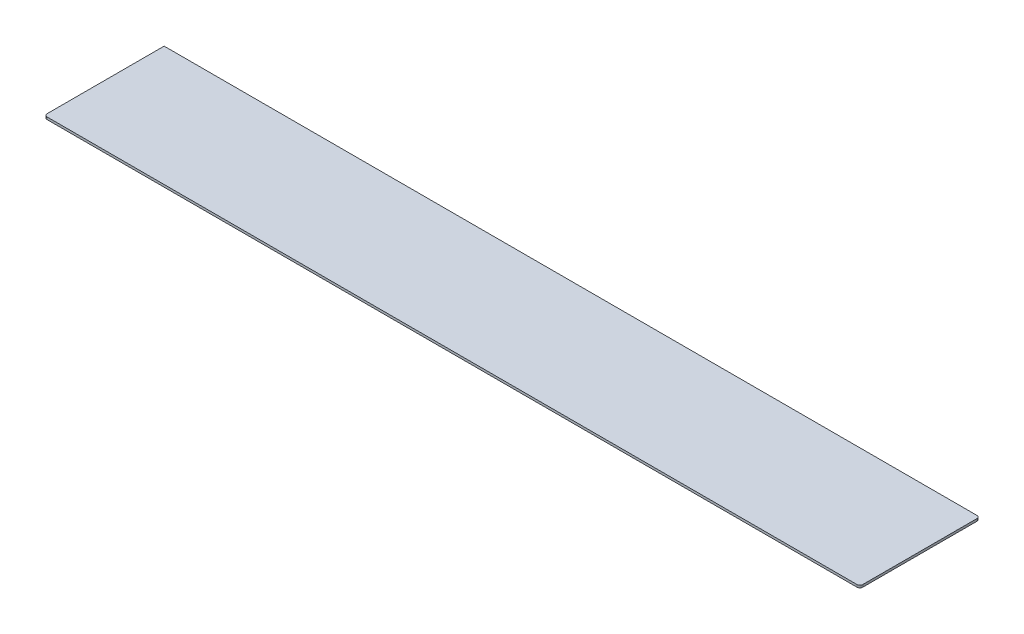
ISO-10303-21;
HEADER;
FILE_DESCRIPTION(('STEP AP214'),'2;1');
FILE_NAME('part.step','',(''),(''),'','','');
FILE_SCHEMA(('AUTOMOTIVE_DESIGN { 1 0 10303 214 1 1 1 1 }'));
ENDSEC;
DATA;
#1=APPLICATION_CONTEXT('core data for automotive mechanical design processes');
#2=APPLICATION_PROTOCOL_DEFINITION('international standard','automotive_design',2000,#1);
#3=PRODUCT_CONTEXT('',#1,'mechanical');
#4=PRODUCT('Part','Part','',(#3));
#5=PRODUCT_RELATED_PRODUCT_CATEGORY('part','',(#4));
#6=PRODUCT_DEFINITION_FORMATION('','',#4);
#7=PRODUCT_DEFINITION_CONTEXT('part definition',#1,'design');
#8=PRODUCT_DEFINITION('design','',#6,#7);
#9=PRODUCT_DEFINITION_SHAPE('','',#8);
#10=(LENGTH_UNIT() NAMED_UNIT(*) SI_UNIT(.MILLI.,.METRE.));
#11=(NAMED_UNIT(*) PLANE_ANGLE_UNIT() SI_UNIT($,.RADIAN.));
#12=(NAMED_UNIT(*) SI_UNIT($,.STERADIAN.) SOLID_ANGLE_UNIT());
#13=UNCERTAINTY_MEASURE_WITH_UNIT(LENGTH_MEASURE(1.E-05),#10,'distance_accuracy_value','');
#14=(GEOMETRIC_REPRESENTATION_CONTEXT(3) GLOBAL_UNCERTAINTY_ASSIGNED_CONTEXT((#13)) GLOBAL_UNIT_ASSIGNED_CONTEXT((#10,
#11,#12)) REPRESENTATION_CONTEXT('',''));
#15=CARTESIAN_POINT('',(0.,0.,0.));
#16=DIRECTION('',(0.,0.,1.));
#17=DIRECTION('',(1.,0.,0.));
#18=AXIS2_PLACEMENT_3D('',#15,#16,#17);
#19=CARTESIAN_POINT('',(279.,0.,1.6));
#20=DIRECTION('',(0.,0.,-1.));
#21=DIRECTION('',(-1.,0.,0.));
#22=AXIS2_PLACEMENT_3D('',#19,#20,#21);
#23=PLANE('',#22);
#24=DIRECTION('',(0.,-1.,0.));
#25=VECTOR('',#24,1.);
#26=CARTESIAN_POINT('',(-279.,0.,1.6));
#27=LINE('',#26,#25);
#28=CARTESIAN_POINT('',(-279.,-1.6,1.6));
#29=VERTEX_POINT('',#28);
#30=CARTESIAN_POINT('',(-279.,-33.,1.6));
#31=VERTEX_POINT('',#30);
#32=EDGE_CURVE('E11',#29,#31,#27,.T.);
#33=ORIENTED_EDGE('',*,*,#32,.T.);
#34=CARTESIAN_POINT('',(-277.,-33.,1.6));
#35=DIRECTION('',(0.,0.,1.));
#36=DIRECTION('',(0.,1.,0.));
#37=AXIS2_PLACEMENT_3D('',#34,#35,#36);
#38=CIRCLE('',#37,2.);
#39=CARTESIAN_POINT('',(-277.,-35.,1.6));
#40=VERTEX_POINT('',#39);
#41=EDGE_CURVE('E26',#31,#40,#38,.T.);
#42=ORIENTED_EDGE('',*,*,#41,.T.);
#43=DIRECTION('',(-1.,0.,0.));
#44=VECTOR('',#43,1.);
#45=CARTESIAN_POINT('',(279.,-35.,1.6));
#46=LINE('',#45,#44);
#47=CARTESIAN_POINT('',(227.,-35.,1.6));
#48=VERTEX_POINT('',#47);
#49=EDGE_CURVE('E256',#48,#40,#46,.T.);
#50=ORIENTED_EDGE('',*,*,#49,.F.);
#51=CARTESIAN_POINT('',(227.,-33.,1.6));
#52=DIRECTION('',(0.,0.,1.));
#53=DIRECTION('',(0.,1.,0.));
#54=AXIS2_PLACEMENT_3D('',#51,#52,#53);
#55=CIRCLE('',#54,2.);
#56=CARTESIAN_POINT('',(229.,-33.,1.6));
#57=VERTEX_POINT('',#56);
#58=EDGE_CURVE('E255',#48,#57,#55,.T.);
#59=ORIENTED_EDGE('',*,*,#58,.T.);
#60=DIRECTION('',(0.,-1.,0.));
#61=VECTOR('',#60,1.);
#62=CARTESIAN_POINT('',(229.,-1.6,1.6));
#63=LINE('',#62,#61);
#64=CARTESIAN_POINT('',(229.,-1.6,1.6));
#65=VERTEX_POINT('',#64);
#66=EDGE_CURVE('E330',#65,#57,#63,.T.);
#67=ORIENTED_EDGE('',*,*,#66,.F.);
#68=DIRECTION('',(-1.,0.,0.));
#69=VECTOR('',#68,1.);
#70=CARTESIAN_POINT('',(279.,-1.6,1.6));
#71=LINE('',#70,#69);
#72=EDGE_CURVE('E251',#65,#29,#71,.T.);
#73=ORIENTED_EDGE('',*,*,#72,.T.);
#74=EDGE_LOOP('',(#33,#42,#50,#59,#67,#73));
#75=FACE_BOUND('',#74,.T.);
#76=DIRECTION('',(0.,-1.,0.));
#77=VECTOR('',#76,1.);
#78=CARTESIAN_POINT('',(206.5,-15.,1.6));
#79=LINE('',#78,#77);
#80=CARTESIAN_POINT('',(206.5,-15.,1.6));
#81=VERTEX_POINT('',#80);
#82=CARTESIAN_POINT('',(206.5,-25.,1.6));
#83=VERTEX_POINT('',#82);
#84=EDGE_CURVE('E242',#81,#83,#79,.T.);
#85=ORIENTED_EDGE('',*,*,#84,.F.);
#86=CARTESIAN_POINT('',(210.,-15.,1.6));
#87=DIRECTION('',(0.,0.,1.));
#88=DIRECTION('',(1.,0.,0.));
#89=AXIS2_PLACEMENT_3D('',#86,#87,#88);
#90=CIRCLE('',#89,3.5);
#91=CARTESIAN_POINT('',(213.5,-15.,1.6));
#92=VERTEX_POINT('',#91);
#93=EDGE_CURVE('E282',#92,#81,#90,.T.);
#94=ORIENTED_EDGE('',*,*,#93,.F.);
#95=DIRECTION('',(0.,1.,0.));
#96=VECTOR('',#95,1.);
#97=CARTESIAN_POINT('',(213.5,-15.,1.6));
#98=LINE('',#97,#96);
#99=CARTESIAN_POINT('',(213.5,-25.,1.6));
#100=VERTEX_POINT('',#99);
#101=EDGE_CURVE('E262',#100,#92,#98,.T.);
#102=ORIENTED_EDGE('',*,*,#101,.F.);
#103=CARTESIAN_POINT('',(210.,-25.,1.6));
#104=DIRECTION('',(0.,0.,1.));
#105=DIRECTION('',(1.,0.,0.));
#106=AXIS2_PLACEMENT_3D('',#103,#104,#105);
#107=CIRCLE('',#106,3.5);
#108=EDGE_CURVE('E238',#83,#100,#107,.T.);
#109=ORIENTED_EDGE('',*,*,#108,.F.);
#110=EDGE_LOOP('',(#85,#94,#102,#109));
#111=FACE_BOUND('',#110,.T.);
#112=DIRECTION('',(0.,-1.,0.));
#113=VECTOR('',#112,1.);
#114=CARTESIAN_POINT('',(-28.5,-15.,1.6));
#115=LINE('',#114,#113);
#116=CARTESIAN_POINT('',(-28.5,-15.,1.6));
#117=VERTEX_POINT('',#116);
#118=CARTESIAN_POINT('',(-28.5,-25.,1.6));
#119=VERTEX_POINT('',#118);
#120=EDGE_CURVE('E250',#117,#119,#115,.T.);
#121=ORIENTED_EDGE('',*,*,#120,.F.);
#122=CARTESIAN_POINT('',(-25.,-15.,1.6));
#123=DIRECTION('',(0.,0.,1.));
#124=DIRECTION('',(1.,0.,0.));
#125=AXIS2_PLACEMENT_3D('',#122,#123,#124);
#126=CIRCLE('',#125,3.5);
#127=CARTESIAN_POINT('',(-21.5,-15.,1.6));
#128=VERTEX_POINT('',#127);
#129=EDGE_CURVE('E377',#128,#117,#126,.T.);
#130=ORIENTED_EDGE('',*,*,#129,.F.);
#131=DIRECTION('',(0.,1.,0.));
#132=VECTOR('',#131,1.);
#133=CARTESIAN_POINT('',(-21.5,-15.,1.6));
#134=LINE('',#133,#132);
#135=CARTESIAN_POINT('',(-21.5,-25.,1.6));
#136=VERTEX_POINT('',#135);
#137=EDGE_CURVE('E319',#136,#128,#134,.T.);
#138=ORIENTED_EDGE('',*,*,#137,.F.);
#139=CARTESIAN_POINT('',(-25.,-25.,1.6));
#140=DIRECTION('',(0.,0.,1.));
#141=DIRECTION('',(1.,0.,0.));
#142=AXIS2_PLACEMENT_3D('',#139,#140,#141);
#143=CIRCLE('',#142,3.5);
#144=EDGE_CURVE('E277',#119,#136,#143,.T.);
#145=ORIENTED_EDGE('',*,*,#144,.F.);
#146=EDGE_LOOP('',(#121,#130,#138,#145));
#147=FACE_BOUND('',#146,.T.);
#148=DIRECTION('',(0.,-1.,0.));
#149=VECTOR('',#148,1.);
#150=CARTESIAN_POINT('',(-263.5,-15.,1.6));
#151=LINE('',#150,#149);
#152=CARTESIAN_POINT('',(-263.5,-15.,1.6));
#153=VERTEX_POINT('',#152);
#154=CARTESIAN_POINT('',(-263.5,-25.,1.6));
#155=VERTEX_POINT('',#154);
#156=EDGE_CURVE('E212',#153,#155,#151,.T.);
#157=ORIENTED_EDGE('',*,*,#156,.F.);
#158=CARTESIAN_POINT('',(-260.,-15.,1.6));
#159=DIRECTION('',(0.,0.,1.));
#160=DIRECTION('',(1.,0.,0.));
#161=AXIS2_PLACEMENT_3D('',#158,#159,#160);
#162=CIRCLE('',#161,3.5);
#163=CARTESIAN_POINT('',(-256.5,-15.,1.6));
#164=VERTEX_POINT('',#163);
#165=EDGE_CURVE('E210',#164,#153,#162,.T.);
#166=ORIENTED_EDGE('',*,*,#165,.F.);
#167=DIRECTION('',(0.,1.,0.));
#168=VECTOR('',#167,1.);
#169=CARTESIAN_POINT('',(-256.5,-15.,1.6));
#170=LINE('',#169,#168);
#171=CARTESIAN_POINT('',(-256.5,-25.,1.6));
#172=VERTEX_POINT('',#171);
#173=EDGE_CURVE('E197',#172,#164,#170,.T.);
#174=ORIENTED_EDGE('',*,*,#173,.F.);
#175=CARTESIAN_POINT('',(-260.,-25.,1.6));
#176=DIRECTION('',(0.,0.,1.));
#177=DIRECTION('',(1.,0.,0.));
#178=AXIS2_PLACEMENT_3D('',#175,#176,#177);
#179=CIRCLE('',#178,3.5);
#180=EDGE_CURVE('E305',#155,#172,#179,.T.);
#181=ORIENTED_EDGE('',*,*,#180,.F.);
#182=EDGE_LOOP('',(#157,#166,#174,#181));
#183=FACE_BOUND('',#182,.T.);
#184=ADVANCED_FACE('F16',(#75,#111,#147,#183),#23,.F.);
#185=CARTESIAN_POINT('',(279.,-35.,0.));
#186=DIRECTION('',(0.,-1.,0.));
#187=DIRECTION('',(0.,0.,-1.));
#188=AXIS2_PLACEMENT_3D('',#185,#186,#187);
#189=PLANE('',#188);
#190=ORIENTED_EDGE('',*,*,#49,.T.);
#191=DIRECTION('',(0.,0.,-1.));
#192=VECTOR('',#191,1.);
#193=CARTESIAN_POINT('',(-277.,-35.,0.));
#194=LINE('',#193,#192);
#195=CARTESIAN_POINT('',(-277.,-35.,0.));
#196=VERTEX_POINT('',#195);
#197=EDGE_CURVE('E383',#40,#196,#194,.T.);
#198=ORIENTED_EDGE('',*,*,#197,.T.);
#199=DIRECTION('',(-1.,0.,0.));
#200=VECTOR('',#199,1.);
#201=CARTESIAN_POINT('',(279.,-35.,0.));
#202=LINE('',#201,#200);
#203=CARTESIAN_POINT('',(227.,-35.,0.));
#204=VERTEX_POINT('',#203);
#205=EDGE_CURVE('E331',#204,#196,#202,.T.);
#206=ORIENTED_EDGE('',*,*,#205,.F.);
#207=DIRECTION('',(0.,0.,1.));
#208=VECTOR('',#207,1.);
#209=CARTESIAN_POINT('',(227.,-35.,1.6));
#210=LINE('',#209,#208);
#211=EDGE_CURVE('E334',#204,#48,#210,.T.);
#212=ORIENTED_EDGE('',*,*,#211,.T.);
#213=EDGE_LOOP('',(#190,#198,#206,#212));
#214=FACE_BOUND('',#213,.T.);
#215=ADVANCED_FACE('F446',(#214),#189,.T.);
#216=CARTESIAN_POINT('',(279.,0.,0.));
#217=DIRECTION('',(0.,0.,-1.));
#218=DIRECTION('',(-1.,0.,0.));
#219=AXIS2_PLACEMENT_3D('',#216,#217,#218);
#220=PLANE('',#219);
#221=ORIENTED_EDGE('',*,*,#205,.T.);
#222=CARTESIAN_POINT('',(-277.,-33.,0.));
#223=DIRECTION('',(0.,0.,-1.));
#224=DIRECTION('',(0.,1.,0.));
#225=AXIS2_PLACEMENT_3D('',#222,#223,#224);
#226=CIRCLE('',#225,2.);
#227=CARTESIAN_POINT('',(-279.,-33.,0.));
#228=VERTEX_POINT('',#227);
#229=EDGE_CURVE('E335',#196,#228,#226,.T.);
#230=ORIENTED_EDGE('',*,*,#229,.T.);
#231=DIRECTION('',(0.,-1.,0.));
#232=VECTOR('',#231,1.);
#233=CARTESIAN_POINT('',(-279.,0.,0.));
#234=LINE('',#233,#232);
#235=CARTESIAN_POINT('',(-279.,0.,0.));
#236=VERTEX_POINT('',#235);
#237=EDGE_CURVE('E396',#236,#228,#234,.T.);
#238=ORIENTED_EDGE('',*,*,#237,.F.);
#239=DIRECTION('',(-1.,0.,0.));
#240=VECTOR('',#239,1.);
#241=CARTESIAN_POINT('',(279.,0.,0.));
#242=LINE('',#241,#240);
#243=CARTESIAN_POINT('',(277.,0.,0.));
#244=VERTEX_POINT('',#243);
#245=EDGE_CURVE('E391',#244,#236,#242,.T.);
#246=ORIENTED_EDGE('',*,*,#245,.F.);
#247=DIRECTION('',(0.,-1.,0.));
#248=VECTOR('',#247,1.);
#249=CARTESIAN_POINT('',(277.,-1.6,0.));
#250=LINE('',#249,#248);
#251=CARTESIAN_POINT('',(277.,-1.6,0.));
#252=VERTEX_POINT('',#251);
#253=EDGE_CURVE('E387',#244,#252,#250,.T.);
#254=ORIENTED_EDGE('',*,*,#253,.T.);
#255=DIRECTION('',(1.,0.,0.));
#256=VECTOR('',#255,1.);
#257=CARTESIAN_POINT('',(279.,-1.6,0.));
#258=LINE('',#257,#256);
#259=CARTESIAN_POINT('',(229.,-1.6,0.));
#260=VERTEX_POINT('',#259);
#261=EDGE_CURVE('E346',#260,#252,#258,.T.);
#262=ORIENTED_EDGE('',*,*,#261,.F.);
#263=DIRECTION('',(0.,1.,0.));
#264=VECTOR('',#263,1.);
#265=CARTESIAN_POINT('',(229.,0.,0.));
#266=LINE('',#265,#264);
#267=CARTESIAN_POINT('',(229.,-33.,0.));
#268=VERTEX_POINT('',#267);
#269=EDGE_CURVE('E365',#268,#260,#266,.T.);
#270=ORIENTED_EDGE('',*,*,#269,.F.);
#271=CARTESIAN_POINT('',(227.,-33.,0.));
#272=DIRECTION('',(0.,0.,-1.));
#273=DIRECTION('',(0.,1.,0.));
#274=AXIS2_PLACEMENT_3D('',#271,#272,#273);
#275=CIRCLE('',#274,2.);
#276=EDGE_CURVE('E357',#268,#204,#275,.T.);
#277=ORIENTED_EDGE('',*,*,#276,.T.);
#278=EDGE_LOOP('',(#221,#230,#238,#246,#254,#262,#270,#277));
#279=FACE_BOUND('',#278,.T.);
#280=CARTESIAN_POINT('',(210.,-15.,0.));
#281=DIRECTION('',(0.,0.,-1.));
#282=DIRECTION('',(0.,1.,0.));
#283=AXIS2_PLACEMENT_3D('',#280,#281,#282);
#284=CIRCLE('',#283,3.5);
#285=CARTESIAN_POINT('',(206.5,-15.,0.));
#286=VERTEX_POINT('',#285);
#287=CARTESIAN_POINT('',(213.5,-15.,0.));
#288=VERTEX_POINT('',#287);
#289=EDGE_CURVE('E304',#286,#288,#284,.T.);
#290=ORIENTED_EDGE('',*,*,#289,.F.);
#291=DIRECTION('',(0.,1.,0.));
#292=VECTOR('',#291,1.);
#293=CARTESIAN_POINT('',(206.5,0.,0.));
#294=LINE('',#293,#292);
#295=CARTESIAN_POINT('',(206.5,-25.,0.));
#296=VERTEX_POINT('',#295);
#297=EDGE_CURVE('E236',#296,#286,#294,.T.);
#298=ORIENTED_EDGE('',*,*,#297,.F.);
#299=CARTESIAN_POINT('',(210.,-25.,0.));
#300=DIRECTION('',(0.,0.,-1.));
#301=DIRECTION('',(0.,1.,0.));
#302=AXIS2_PLACEMENT_3D('',#299,#300,#301);
#303=CIRCLE('',#302,3.5);
#304=CARTESIAN_POINT('',(213.5,-25.,0.));
#305=VERTEX_POINT('',#304);
#306=EDGE_CURVE('E266',#305,#296,#303,.T.);
#307=ORIENTED_EDGE('',*,*,#306,.F.);
#308=DIRECTION('',(0.,-1.,0.));
#309=VECTOR('',#308,1.);
#310=CARTESIAN_POINT('',(213.5,0.,0.));
#311=LINE('',#310,#309);
#312=EDGE_CURVE('E278',#288,#305,#311,.T.);
#313=ORIENTED_EDGE('',*,*,#312,.F.);
#314=EDGE_LOOP('',(#290,#298,#307,#313));
#315=FACE_BOUND('',#314,.T.);
#316=CARTESIAN_POINT('',(-25.,-15.,0.));
#317=DIRECTION('',(0.,0.,-1.));
#318=DIRECTION('',(0.,1.,0.));
#319=AXIS2_PLACEMENT_3D('',#316,#317,#318);
#320=CIRCLE('',#319,3.5);
#321=CARTESIAN_POINT('',(-28.5,-15.,0.));
#322=VERTEX_POINT('',#321);
#323=CARTESIAN_POINT('',(-21.5,-15.,0.));
#324=VERTEX_POINT('',#323);
#325=EDGE_CURVE('E326',#322,#324,#320,.T.);
#326=ORIENTED_EDGE('',*,*,#325,.F.);
#327=DIRECTION('',(0.,1.,0.));
#328=VECTOR('',#327,1.);
#329=CARTESIAN_POINT('',(-28.5,0.,0.));
#330=LINE('',#329,#328);
#331=CARTESIAN_POINT('',(-28.5,-25.,0.));
#332=VERTEX_POINT('',#331);
#333=EDGE_CURVE('E249',#332,#322,#330,.T.);
#334=ORIENTED_EDGE('',*,*,#333,.F.);
#335=CARTESIAN_POINT('',(-25.,-25.,0.));
#336=DIRECTION('',(0.,0.,-1.));
#337=DIRECTION('',(0.,1.,0.));
#338=AXIS2_PLACEMENT_3D('',#335,#336,#337);
#339=CIRCLE('',#338,3.5);
#340=CARTESIAN_POINT('',(-21.5,-25.,0.));
#341=VERTEX_POINT('',#340);
#342=EDGE_CURVE('E276',#341,#332,#339,.T.);
#343=ORIENTED_EDGE('',*,*,#342,.F.);
#344=DIRECTION('',(0.,-1.,0.));
#345=VECTOR('',#344,1.);
#346=CARTESIAN_POINT('',(-21.5,0.,0.));
#347=LINE('',#346,#345);
#348=EDGE_CURVE('E411',#324,#341,#347,.T.);
#349=ORIENTED_EDGE('',*,*,#348,.F.);
#350=EDGE_LOOP('',(#326,#334,#343,#349));
#351=FACE_BOUND('',#350,.T.);
#352=CARTESIAN_POINT('',(-260.,-15.,0.));
#353=DIRECTION('',(0.,0.,-1.));
#354=DIRECTION('',(0.,1.,0.));
#355=AXIS2_PLACEMENT_3D('',#352,#353,#354);
#356=CIRCLE('',#355,3.5);
#357=CARTESIAN_POINT('',(-263.5,-15.,0.));
#358=VERTEX_POINT('',#357);
#359=CARTESIAN_POINT('',(-256.5,-15.,0.));
#360=VERTEX_POINT('',#359);
#361=EDGE_CURVE('E222',#358,#360,#356,.T.);
#362=ORIENTED_EDGE('',*,*,#361,.F.);
#363=DIRECTION('',(0.,1.,0.));
#364=VECTOR('',#363,1.);
#365=CARTESIAN_POINT('',(-263.5,0.,0.));
#366=LINE('',#365,#364);
#367=CARTESIAN_POINT('',(-263.5,-25.,0.));
#368=VERTEX_POINT('',#367);
#369=EDGE_CURVE('E309',#368,#358,#366,.T.);
#370=ORIENTED_EDGE('',*,*,#369,.F.);
#371=CARTESIAN_POINT('',(-260.,-25.,0.));
#372=DIRECTION('',(0.,0.,-1.));
#373=DIRECTION('',(0.,1.,0.));
#374=AXIS2_PLACEMENT_3D('',#371,#372,#373);
#375=CIRCLE('',#374,3.5);
#376=CARTESIAN_POINT('',(-256.5,-25.,0.));
#377=VERTEX_POINT('',#376);
#378=EDGE_CURVE('E19',#377,#368,#375,.T.);
#379=ORIENTED_EDGE('',*,*,#378,.F.);
#380=DIRECTION('',(0.,-1.,0.));
#381=VECTOR('',#380,1.);
#382=CARTESIAN_POINT('',(-256.5,0.,0.));
#383=LINE('',#382,#381);
#384=EDGE_CURVE('E217',#360,#377,#383,.T.);
#385=ORIENTED_EDGE('',*,*,#384,.F.);
#386=EDGE_LOOP('',(#362,#370,#379,#385));
#387=FACE_BOUND('',#386,.T.);
#388=ADVANCED_FACE('F438',(#279,#315,#351,#387),#220,.T.);
#389=CARTESIAN_POINT('',(279.,0.,82.));
#390=DIRECTION('',(0.,1.,0.));
#391=DIRECTION('',(1.,0.,0.));
#392=AXIS2_PLACEMENT_3D('',#389,#390,#391);
#393=PLANE('',#392);
#394=DIRECTION('',(0.,0.,-1.));
#395=VECTOR('',#394,1.);
#396=CARTESIAN_POINT('',(279.,0.,82.));
#397=LINE('',#396,#395);
#398=CARTESIAN_POINT('',(279.,0.,80.));
#399=VERTEX_POINT('',#398);
#400=CARTESIAN_POINT('',(279.,0.,2.));
#401=VERTEX_POINT('',#400);
#402=EDGE_CURVE('E460',#399,#401,#397,.T.);
#403=ORIENTED_EDGE('',*,*,#402,.T.);
#404=CARTESIAN_POINT('',(277.,0.,2.));
#405=DIRECTION('',(0.,1.,0.));
#406=DIRECTION('',(0.,0.,1.));
#407=AXIS2_PLACEMENT_3D('',#404,#405,#406);
#408=CIRCLE('',#407,2.);
#409=EDGE_CURVE('E479',#401,#244,#408,.T.);
#410=ORIENTED_EDGE('',*,*,#409,.T.);
#411=ORIENTED_EDGE('',*,*,#245,.T.);
#412=DIRECTION('',(0.,0.,-1.));
#413=VECTOR('',#412,1.);
#414=CARTESIAN_POINT('',(-279.,0.,82.));
#415=LINE('',#414,#413);
#416=CARTESIAN_POINT('',(-279.,0.,80.));
#417=VERTEX_POINT('',#416);
#418=EDGE_CURVE('E299',#417,#236,#415,.T.);
#419=ORIENTED_EDGE('',*,*,#418,.F.);
#420=CARTESIAN_POINT('',(-277.,0.,80.));
#421=DIRECTION('',(0.,1.,0.));
#422=DIRECTION('',(0.,0.,1.));
#423=AXIS2_PLACEMENT_3D('',#420,#421,#422);
#424=CIRCLE('',#423,2.);
#425=CARTESIAN_POINT('',(-277.,0.,82.));
#426=VERTEX_POINT('',#425);
#427=EDGE_CURVE('E260',#417,#426,#424,.T.);
#428=ORIENTED_EDGE('',*,*,#427,.T.);
#429=DIRECTION('',(-1.,0.,0.));
#430=VECTOR('',#429,1.);
#431=CARTESIAN_POINT('',(279.,0.,82.));
#432=LINE('',#431,#430);
#433=CARTESIAN_POINT('',(277.,0.,82.));
#434=VERTEX_POINT('',#433);
#435=EDGE_CURVE('E286',#434,#426,#432,.T.);
#436=ORIENTED_EDGE('',*,*,#435,.F.);
#437=CARTESIAN_POINT('',(277.,0.,80.));
#438=DIRECTION('',(0.,1.,0.));
#439=DIRECTION('',(0.,0.,1.));
#440=AXIS2_PLACEMENT_3D('',#437,#438,#439);
#441=CIRCLE('',#440,2.);
#442=EDGE_CURVE('E257',#434,#399,#441,.T.);
#443=ORIENTED_EDGE('',*,*,#442,.T.);
#444=EDGE_LOOP('',(#403,#410,#411,#419,#428,#436,#443));
#445=FACE_BOUND('',#444,.T.);
#446=ADVANCED_FACE('F561',(#445),#393,.T.);
#447=CARTESIAN_POINT('',(279.,-1.6,82.));
#448=DIRECTION('',(0.,0.,1.));
#449=DIRECTION('',(1.,0.,0.));
#450=AXIS2_PLACEMENT_3D('',#447,#448,#449);
#451=PLANE('',#450);
#452=DIRECTION('',(-1.,0.,0.));
#453=VECTOR('',#452,1.);
#454=CARTESIAN_POINT('',(279.,-1.6,82.));
#455=LINE('',#454,#453);
#456=CARTESIAN_POINT('',(277.,-1.6,82.));
#457=VERTEX_POINT('',#456);
#458=CARTESIAN_POINT('',(-277.,-1.6,82.));
#459=VERTEX_POINT('',#458);
#460=EDGE_CURVE('E267',#457,#459,#455,.T.);
#461=ORIENTED_EDGE('',*,*,#460,.F.);
#462=DIRECTION('',(0.,1.,0.));
#463=VECTOR('',#462,1.);
#464=CARTESIAN_POINT('',(277.,0.,82.));
#465=LINE('',#464,#463);
#466=EDGE_CURVE('E261',#457,#434,#465,.T.);
#467=ORIENTED_EDGE('',*,*,#466,.T.);
#468=ORIENTED_EDGE('',*,*,#435,.T.);
#469=DIRECTION('',(0.,-1.,0.));
#470=VECTOR('',#469,1.);
#471=CARTESIAN_POINT('',(-277.,-1.6,82.));
#472=LINE('',#471,#470);
#473=EDGE_CURVE('E234',#426,#459,#472,.T.);
#474=ORIENTED_EDGE('',*,*,#473,.T.);
#475=EDGE_LOOP('',(#461,#467,#468,#474));
#476=FACE_BOUND('',#475,.T.);
#477=ADVANCED_FACE('F521',(#476),#451,.T.);
#478=CARTESIAN_POINT('',(279.,-1.6,82.));
#479=DIRECTION('',(0.,1.,0.));
#480=DIRECTION('',(1.,0.,0.));
#481=AXIS2_PLACEMENT_3D('',#478,#479,#480);
#482=PLANE('',#481);
#483=ORIENTED_EDGE('',*,*,#261,.T.);
#484=CARTESIAN_POINT('',(277.,-1.6,2.));
#485=DIRECTION('',(0.,-1.,0.));
#486=DIRECTION('',(0.,0.,1.));
#487=AXIS2_PLACEMENT_3D('',#484,#485,#486);
#488=CIRCLE('',#487,2.);
#489=CARTESIAN_POINT('',(279.,-1.6,2.));
#490=VERTEX_POINT('',#489);
#491=EDGE_CURVE('E338',#252,#490,#488,.T.);
#492=ORIENTED_EDGE('',*,*,#491,.T.);
#493=DIRECTION('',(0.,0.,-1.));
#494=VECTOR('',#493,1.);
#495=CARTESIAN_POINT('',(279.,-1.6,82.));
#496=LINE('',#495,#494);
#497=CARTESIAN_POINT('',(279.,-1.6,80.));
#498=VERTEX_POINT('',#497);
#499=EDGE_CURVE('E314',#498,#490,#496,.T.);
#500=ORIENTED_EDGE('',*,*,#499,.F.);
#501=CARTESIAN_POINT('',(277.,-1.6,80.));
#502=DIRECTION('',(0.,-1.,0.));
#503=DIRECTION('',(0.,0.,1.));
#504=AXIS2_PLACEMENT_3D('',#501,#502,#503);
#505=CIRCLE('',#504,2.);
#506=EDGE_CURVE('E270',#498,#457,#505,.T.);
#507=ORIENTED_EDGE('',*,*,#506,.T.);
#508=ORIENTED_EDGE('',*,*,#460,.T.);
#509=CARTESIAN_POINT('',(-277.,-1.6,80.));
#510=DIRECTION('',(0.,-1.,0.));
#511=DIRECTION('',(0.,0.,1.));
#512=AXIS2_PLACEMENT_3D('',#509,#510,#511);
#513=CIRCLE('',#512,2.);
#514=CARTESIAN_POINT('',(-279.,-1.6,80.));
#515=VERTEX_POINT('',#514);
#516=EDGE_CURVE('E271',#459,#515,#513,.T.);
#517=ORIENTED_EDGE('',*,*,#516,.T.);
#518=DIRECTION('',(0.,0.,-1.));
#519=VECTOR('',#518,1.);
#520=CARTESIAN_POINT('',(-279.,-1.6,82.));
#521=LINE('',#520,#519);
#522=EDGE_CURVE('E317',#515,#29,#521,.T.);
#523=ORIENTED_EDGE('',*,*,#522,.T.);
#524=ORIENTED_EDGE('',*,*,#72,.F.);
#525=DIRECTION('',(0.,0.,1.));
#526=VECTOR('',#525,1.);
#527=CARTESIAN_POINT('',(229.,-1.6,-8.4));
#528=LINE('',#527,#526);
#529=EDGE_CURVE('E230',#260,#65,#528,.T.);
#530=ORIENTED_EDGE('',*,*,#529,.F.);
#531=EDGE_LOOP('',(#483,#492,#500,#507,#508,#517,#523,#524,#530));
#532=FACE_BOUND('',#531,.T.);
#533=ADVANCED_FACE('F527',(#532),#482,.F.);
#534=CARTESIAN_POINT('',(279.,0.,0.));
#535=DIRECTION('',(-1.,0.,0.));
#536=DIRECTION('',(0.,0.,1.));
#537=AXIS2_PLACEMENT_3D('',#534,#535,#536);
#538=PLANE('',#537);
#539=ORIENTED_EDGE('',*,*,#499,.T.);
#540=DIRECTION('',(0.,1.,0.));
#541=VECTOR('',#540,1.);
#542=CARTESIAN_POINT('',(279.,0.,2.));
#543=LINE('',#542,#541);
#544=EDGE_CURVE('E318',#490,#401,#543,.T.);
#545=ORIENTED_EDGE('',*,*,#544,.T.);
#546=ORIENTED_EDGE('',*,*,#402,.F.);
#547=DIRECTION('',(0.,-1.,0.));
#548=VECTOR('',#547,1.);
#549=CARTESIAN_POINT('',(279.,-1.6,80.));
#550=LINE('',#549,#548);
#551=EDGE_CURVE('E395',#399,#498,#550,.T.);
#552=ORIENTED_EDGE('',*,*,#551,.T.);
#553=EDGE_LOOP('',(#539,#545,#546,#552));
#554=FACE_BOUND('',#553,.T.);
#555=ADVANCED_FACE('F554',(#554),#538,.F.);
#556=CARTESIAN_POINT('',(-279.,0.,0.));
#557=DIRECTION('',(-1.,0.,0.));
#558=DIRECTION('',(0.,0.,1.));
#559=AXIS2_PLACEMENT_3D('',#556,#557,#558);
#560=PLANE('',#559);
#561=ORIENTED_EDGE('',*,*,#237,.T.);
#562=DIRECTION('',(0.,0.,1.));
#563=VECTOR('',#562,1.);
#564=CARTESIAN_POINT('',(-279.,-33.,0.));
#565=LINE('',#564,#563);
#566=EDGE_CURVE('E298',#228,#31,#565,.T.);
#567=ORIENTED_EDGE('',*,*,#566,.T.);
#568=ORIENTED_EDGE('',*,*,#32,.F.);
#569=ORIENTED_EDGE('',*,*,#522,.F.);
#570=DIRECTION('',(0.,1.,0.));
#571=VECTOR('',#570,1.);
#572=CARTESIAN_POINT('',(-279.,0.,80.));
#573=LINE('',#572,#571);
#574=EDGE_CURVE('E294',#515,#417,#573,.T.);
#575=ORIENTED_EDGE('',*,*,#574,.T.);
#576=ORIENTED_EDGE('',*,*,#418,.T.);
#577=EDGE_LOOP('',(#561,#567,#568,#569,#575,#576));
#578=FACE_BOUND('',#577,.T.);
#579=ADVANCED_FACE('F430',(#578),#560,.T.);
#580=CARTESIAN_POINT('',(229.,-1.6,-8.4));
#581=DIRECTION('',(-1.,0.,0.));
#582=DIRECTION('',(0.,0.,1.));
#583=AXIS2_PLACEMENT_3D('',#580,#581,#582);
#584=PLANE('',#583);
#585=ORIENTED_EDGE('',*,*,#66,.T.);
#586=DIRECTION('',(0.,0.,-1.));
#587=VECTOR('',#586,1.);
#588=CARTESIAN_POINT('',(229.,-33.,0.));
#589=LINE('',#588,#587);
#590=EDGE_CURVE('E366',#57,#268,#589,.T.);
#591=ORIENTED_EDGE('',*,*,#590,.T.);
#592=ORIENTED_EDGE('',*,*,#269,.T.);
#593=ORIENTED_EDGE('',*,*,#529,.T.);
#594=EDGE_LOOP('',(#585,#591,#592,#593));
#595=FACE_BOUND('',#594,.T.);
#596=ADVANCED_FACE('F830',(#595),#584,.F.);
#597=CARTESIAN_POINT('',(-260.,-15.,-8.4));
#598=DIRECTION('',(0.,0.,1.));
#599=DIRECTION('',(1.,0.,0.));
#600=AXIS2_PLACEMENT_3D('',#597,#598,#599);
#601=CYLINDRICAL_SURFACE('',#600,3.5);
#602=ORIENTED_EDGE('',*,*,#361,.T.);
#603=DIRECTION('',(0.,0.,1.));
#604=VECTOR('',#603,1.);
#605=CARTESIAN_POINT('',(-256.5,-15.,-8.4));
#606=LINE('',#605,#604);
#607=EDGE_CURVE('E202',#360,#164,#606,.T.);
#608=ORIENTED_EDGE('',*,*,#607,.T.);
#609=ORIENTED_EDGE('',*,*,#165,.T.);
#610=DIRECTION('',(0.,0.,1.));
#611=VECTOR('',#610,1.);
#612=CARTESIAN_POINT('',(-263.5,-15.,-8.4));
#613=LINE('',#612,#611);
#614=EDGE_CURVE('E325',#358,#153,#613,.T.);
#615=ORIENTED_EDGE('',*,*,#614,.F.);
#616=EDGE_LOOP('',(#602,#608,#609,#615));
#617=FACE_BOUND('',#616,.T.);
#618=ADVANCED_FACE('F220',(#617),#601,.F.);
#619=CARTESIAN_POINT('',(-256.5,-15.,-8.4));
#620=DIRECTION('',(1.,0.,0.));
#621=DIRECTION('',(0.,1.,0.));
#622=AXIS2_PLACEMENT_3D('',#619,#620,#621);
#623=PLANE('',#622);
#624=ORIENTED_EDGE('',*,*,#384,.T.);
#625=DIRECTION('',(0.,0.,1.));
#626=VECTOR('',#625,1.);
#627=CARTESIAN_POINT('',(-256.5,-25.,-8.4));
#628=LINE('',#627,#626);
#629=EDGE_CURVE('E204',#377,#172,#628,.T.);
#630=ORIENTED_EDGE('',*,*,#629,.T.);
#631=ORIENTED_EDGE('',*,*,#173,.T.);
#632=ORIENTED_EDGE('',*,*,#607,.F.);
#633=EDGE_LOOP('',(#624,#630,#631,#632));
#634=FACE_BOUND('',#633,.T.);
#635=ADVANCED_FACE('F200',(#634),#623,.F.);
#636=CARTESIAN_POINT('',(-260.,-25.,-8.4));
#637=DIRECTION('',(0.,0.,1.));
#638=DIRECTION('',(1.,0.,0.));
#639=AXIS2_PLACEMENT_3D('',#636,#637,#638);
#640=CYLINDRICAL_SURFACE('',#639,3.5);
#641=ORIENTED_EDGE('',*,*,#378,.T.);
#642=DIRECTION('',(0.,0.,1.));
#643=VECTOR('',#642,1.);
#644=CARTESIAN_POINT('',(-263.5,-25.,-8.4));
#645=LINE('',#644,#643);
#646=EDGE_CURVE('E308',#368,#155,#645,.T.);
#647=ORIENTED_EDGE('',*,*,#646,.T.);
#648=ORIENTED_EDGE('',*,*,#180,.T.);
#649=ORIENTED_EDGE('',*,*,#629,.F.);
#650=EDGE_LOOP('',(#641,#647,#648,#649));
#651=FACE_BOUND('',#650,.T.);
#652=ADVANCED_FACE('F593',(#651),#640,.F.);
#653=CARTESIAN_POINT('',(-263.5,-15.,-8.4));
#654=DIRECTION('',(-1.,0.,0.));
#655=DIRECTION('',(0.,0.,1.));
#656=AXIS2_PLACEMENT_3D('',#653,#654,#655);
#657=PLANE('',#656);
#658=ORIENTED_EDGE('',*,*,#369,.T.);
#659=ORIENTED_EDGE('',*,*,#614,.T.);
#660=ORIENTED_EDGE('',*,*,#156,.T.);
#661=ORIENTED_EDGE('',*,*,#646,.F.);
#662=EDGE_LOOP('',(#658,#659,#660,#661));
#663=FACE_BOUND('',#662,.T.);
#664=ADVANCED_FACE('F590',(#663),#657,.F.);
#665=CARTESIAN_POINT('',(-25.,-15.,-8.4));
#666=DIRECTION('',(0.,0.,1.));
#667=DIRECTION('',(1.,0.,0.));
#668=AXIS2_PLACEMENT_3D('',#665,#666,#667);
#669=CYLINDRICAL_SURFACE('',#668,3.5);
#670=ORIENTED_EDGE('',*,*,#325,.T.);
#671=DIRECTION('',(0.,0.,1.));
#672=VECTOR('',#671,1.);
#673=CARTESIAN_POINT('',(-21.5,-15.,-8.4));
#674=LINE('',#673,#672);
#675=EDGE_CURVE('E373',#324,#128,#674,.T.);
#676=ORIENTED_EDGE('',*,*,#675,.T.);
#677=ORIENTED_EDGE('',*,*,#129,.T.);
#678=DIRECTION('',(0.,0.,1.));
#679=VECTOR('',#678,1.);
#680=CARTESIAN_POINT('',(-28.5,-15.,-8.4));
#681=LINE('',#680,#679);
#682=EDGE_CURVE('E245',#322,#117,#681,.T.);
#683=ORIENTED_EDGE('',*,*,#682,.F.);
#684=EDGE_LOOP('',(#670,#676,#677,#683));
#685=FACE_BOUND('',#684,.T.);
#686=ADVANCED_FACE('F592',(#685),#669,.F.);
#687=CARTESIAN_POINT('',(-21.5,-15.,-8.4));
#688=DIRECTION('',(1.,0.,0.));
#689=DIRECTION('',(0.,1.,0.));
#690=AXIS2_PLACEMENT_3D('',#687,#688,#689);
#691=PLANE('',#690);
#692=ORIENTED_EDGE('',*,*,#348,.T.);
#693=DIRECTION('',(0.,0.,1.));
#694=VECTOR('',#693,1.);
#695=CARTESIAN_POINT('',(-21.5,-25.,-8.4));
#696=LINE('',#695,#694);
#697=EDGE_CURVE('E322',#341,#136,#696,.T.);
#698=ORIENTED_EDGE('',*,*,#697,.T.);
#699=ORIENTED_EDGE('',*,*,#137,.T.);
#700=ORIENTED_EDGE('',*,*,#675,.F.);
#701=EDGE_LOOP('',(#692,#698,#699,#700));
#702=FACE_BOUND('',#701,.T.);
#703=ADVANCED_FACE('F599',(#702),#691,.F.);
#704=CARTESIAN_POINT('',(-25.,-25.,-8.4));
#705=DIRECTION('',(0.,0.,1.));
#706=DIRECTION('',(1.,0.,0.));
#707=AXIS2_PLACEMENT_3D('',#704,#705,#706);
#708=CYLINDRICAL_SURFACE('',#707,3.5);
#709=ORIENTED_EDGE('',*,*,#342,.T.);
#710=DIRECTION('',(0.,0.,1.));
#711=VECTOR('',#710,1.);
#712=CARTESIAN_POINT('',(-28.5,-25.,-8.4));
#713=LINE('',#712,#711);
#714=EDGE_CURVE('E272',#332,#119,#713,.T.);
#715=ORIENTED_EDGE('',*,*,#714,.T.);
#716=ORIENTED_EDGE('',*,*,#144,.T.);
#717=ORIENTED_EDGE('',*,*,#697,.F.);
#718=EDGE_LOOP('',(#709,#715,#716,#717));
#719=FACE_BOUND('',#718,.T.);
#720=ADVANCED_FACE('F879',(#719),#708,.F.);
#721=CARTESIAN_POINT('',(-28.5,-15.,-8.4));
#722=DIRECTION('',(-1.,0.,0.));
#723=DIRECTION('',(0.,0.,1.));
#724=AXIS2_PLACEMENT_3D('',#721,#722,#723);
#725=PLANE('',#724);
#726=ORIENTED_EDGE('',*,*,#333,.T.);
#727=ORIENTED_EDGE('',*,*,#682,.T.);
#728=ORIENTED_EDGE('',*,*,#120,.T.);
#729=ORIENTED_EDGE('',*,*,#714,.F.);
#730=EDGE_LOOP('',(#726,#727,#728,#729));
#731=FACE_BOUND('',#730,.T.);
#732=ADVANCED_FACE('F896',(#731),#725,.F.);
#733=CARTESIAN_POINT('',(210.,-15.,-8.4));
#734=DIRECTION('',(0.,0.,1.));
#735=DIRECTION('',(1.,0.,0.));
#736=AXIS2_PLACEMENT_3D('',#733,#734,#735);
#737=CYLINDRICAL_SURFACE('',#736,3.5);
#738=ORIENTED_EDGE('',*,*,#289,.T.);
#739=DIRECTION('',(0.,0.,1.));
#740=VECTOR('',#739,1.);
#741=CARTESIAN_POINT('',(213.5,-15.,-8.4));
#742=LINE('',#741,#740);
#743=EDGE_CURVE('E300',#288,#92,#742,.T.);
#744=ORIENTED_EDGE('',*,*,#743,.T.);
#745=ORIENTED_EDGE('',*,*,#93,.T.);
#746=DIRECTION('',(0.,0.,1.));
#747=VECTOR('',#746,1.);
#748=CARTESIAN_POINT('',(206.5,-15.,-8.4));
#749=LINE('',#748,#747);
#750=EDGE_CURVE('E239',#286,#81,#749,.T.);
#751=ORIENTED_EDGE('',*,*,#750,.F.);
#752=EDGE_LOOP('',(#738,#744,#745,#751));
#753=FACE_BOUND('',#752,.T.);
#754=ADVANCED_FACE('F810',(#753),#737,.F.);
#755=CARTESIAN_POINT('',(213.5,-15.,-8.4));
#756=DIRECTION('',(1.,0.,0.));
#757=DIRECTION('',(0.,1.,0.));
#758=AXIS2_PLACEMENT_3D('',#755,#756,#757);
#759=PLANE('',#758);
#760=ORIENTED_EDGE('',*,*,#312,.T.);
#761=DIRECTION('',(0.,0.,1.));
#762=VECTOR('',#761,1.);
#763=CARTESIAN_POINT('',(213.5,-25.,-8.4));
#764=LINE('',#763,#762);
#765=EDGE_CURVE('E265',#305,#100,#764,.T.);
#766=ORIENTED_EDGE('',*,*,#765,.T.);
#767=ORIENTED_EDGE('',*,*,#101,.T.);
#768=ORIENTED_EDGE('',*,*,#743,.F.);
#769=EDGE_LOOP('',(#760,#766,#767,#768));
#770=FACE_BOUND('',#769,.T.);
#771=ADVANCED_FACE('F582',(#770),#759,.F.);
#772=CARTESIAN_POINT('',(210.,-25.,-8.4));
#773=DIRECTION('',(0.,0.,1.));
#774=DIRECTION('',(1.,0.,0.));
#775=AXIS2_PLACEMENT_3D('',#772,#773,#774);
#776=CYLINDRICAL_SURFACE('',#775,3.5);
#777=ORIENTED_EDGE('',*,*,#306,.T.);
#778=DIRECTION('',(0.,0.,1.));
#779=VECTOR('',#778,1.);
#780=CARTESIAN_POINT('',(206.5,-25.,-8.4));
#781=LINE('',#780,#779);
#782=EDGE_CURVE('E313',#296,#83,#781,.T.);
#783=ORIENTED_EDGE('',*,*,#782,.T.);
#784=ORIENTED_EDGE('',*,*,#108,.T.);
#785=ORIENTED_EDGE('',*,*,#765,.F.);
#786=EDGE_LOOP('',(#777,#783,#784,#785));
#787=FACE_BOUND('',#786,.T.);
#788=ADVANCED_FACE('F587',(#787),#776,.F.);
#789=CARTESIAN_POINT('',(206.5,-15.,-8.4));
#790=DIRECTION('',(-1.,0.,0.));
#791=DIRECTION('',(0.,0.,1.));
#792=AXIS2_PLACEMENT_3D('',#789,#790,#791);
#793=PLANE('',#792);
#794=ORIENTED_EDGE('',*,*,#297,.T.);
#795=ORIENTED_EDGE('',*,*,#750,.T.);
#796=ORIENTED_EDGE('',*,*,#84,.T.);
#797=ORIENTED_EDGE('',*,*,#782,.F.);
#798=EDGE_LOOP('',(#794,#795,#796,#797));
#799=FACE_BOUND('',#798,.T.);
#800=ADVANCED_FACE('F584',(#799),#793,.F.);
#801=CARTESIAN_POINT('',(-277.,-33.,0.));
#802=DIRECTION('',(0.,0.,1.));
#803=DIRECTION('',(1.,0.,0.));
#804=AXIS2_PLACEMENT_3D('',#801,#802,#803);
#805=CYLINDRICAL_SURFACE('',#804,2.);
#806=ORIENTED_EDGE('',*,*,#229,.F.);
#807=ORIENTED_EDGE('',*,*,#197,.F.);
#808=ORIENTED_EDGE('',*,*,#41,.F.);
#809=ORIENTED_EDGE('',*,*,#566,.F.);
#810=EDGE_LOOP('',(#806,#807,#808,#809));
#811=FACE_BOUND('',#810,.T.);
#812=ADVANCED_FACE('F434',(#811),#805,.T.);
#813=CARTESIAN_POINT('',(227.,-33.,0.));
#814=DIRECTION('',(0.,0.,-1.));
#815=DIRECTION('',(-1.,0.,0.));
#816=AXIS2_PLACEMENT_3D('',#813,#814,#815);
#817=CYLINDRICAL_SURFACE('',#816,2.);
#818=ORIENTED_EDGE('',*,*,#276,.F.);
#819=ORIENTED_EDGE('',*,*,#590,.F.);
#820=ORIENTED_EDGE('',*,*,#58,.F.);
#821=ORIENTED_EDGE('',*,*,#211,.F.);
#822=EDGE_LOOP('',(#818,#819,#820,#821));
#823=FACE_BOUND('',#822,.T.);
#824=ADVANCED_FACE('F818',(#823),#817,.T.);
#825=CARTESIAN_POINT('',(277.,0.,2.));
#826=DIRECTION('',(0.,1.,0.));
#827=DIRECTION('',(0.,0.,1.));
#828=AXIS2_PLACEMENT_3D('',#825,#826,#827);
#829=CYLINDRICAL_SURFACE('',#828,2.);
#830=ORIENTED_EDGE('',*,*,#409,.F.);
#831=ORIENTED_EDGE('',*,*,#544,.F.);
#832=ORIENTED_EDGE('',*,*,#491,.F.);
#833=ORIENTED_EDGE('',*,*,#253,.F.);
#834=EDGE_LOOP('',(#830,#831,#832,#833));
#835=FACE_BOUND('',#834,.T.);
#836=ADVANCED_FACE('F552',(#835),#829,.T.);
#837=CARTESIAN_POINT('',(277.,-1.6,80.));
#838=DIRECTION('',(0.,-1.,0.));
#839=DIRECTION('',(0.,0.,-1.));
#840=AXIS2_PLACEMENT_3D('',#837,#838,#839);
#841=CYLINDRICAL_SURFACE('',#840,2.);
#842=ORIENTED_EDGE('',*,*,#506,.F.);
#843=ORIENTED_EDGE('',*,*,#551,.F.);
#844=ORIENTED_EDGE('',*,*,#442,.F.);
#845=ORIENTED_EDGE('',*,*,#466,.F.);
#846=EDGE_LOOP('',(#842,#843,#844,#845));
#847=FACE_BOUND('',#846,.T.);
#848=ADVANCED_FACE('F557',(#847),#841,.T.);
#849=CARTESIAN_POINT('',(-277.,0.,80.));
#850=DIRECTION('',(0.,1.,0.));
#851=DIRECTION('',(0.,0.,1.));
#852=AXIS2_PLACEMENT_3D('',#849,#850,#851);
#853=CYLINDRICAL_SURFACE('',#852,2.);
#854=ORIENTED_EDGE('',*,*,#516,.F.);
#855=ORIENTED_EDGE('',*,*,#473,.F.);
#856=ORIENTED_EDGE('',*,*,#427,.F.);
#857=ORIENTED_EDGE('',*,*,#574,.F.);
#858=EDGE_LOOP('',(#854,#855,#856,#857));
#859=FACE_BOUND('',#858,.T.);
#860=ADVANCED_FACE('F526',(#859),#853,.T.);
#861=CLOSED_SHELL('',(#184,#215,#388,#446,#477,#533,#555,#579,#596,#618,#635,#652,#664,#686,
#703,#720,#732,#754,#771,#788,#800,#812,#824,#836,#848,#860));
#862=MANIFOLD_SOLID_BREP('B1',#861);
#863=ADVANCED_BREP_SHAPE_REPRESENTATION('',(#18,#862),#14);
#864=SHAPE_DEFINITION_REPRESENTATION(#9,#863);
ENDSEC;
END-ISO-10303-21;
